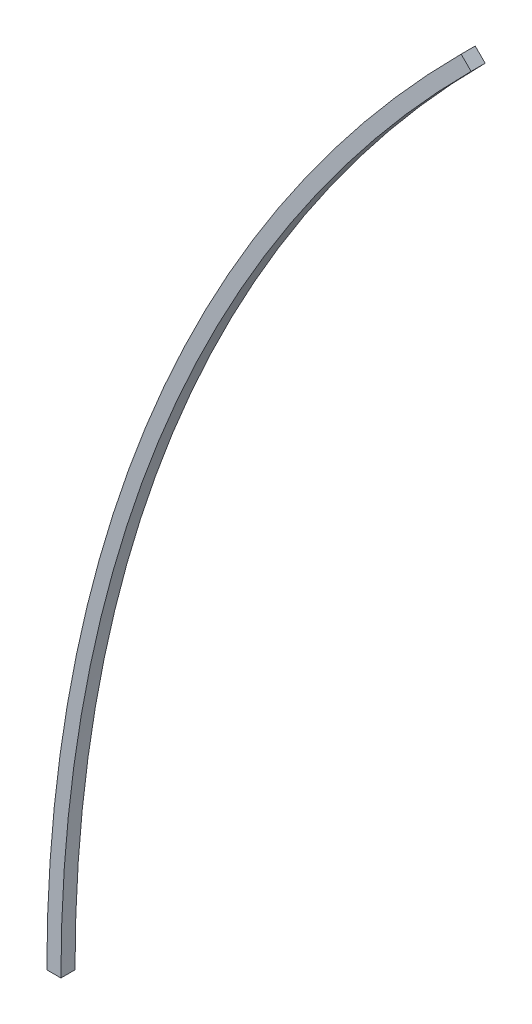
ISO-10303-21;
HEADER;
FILE_DESCRIPTION(('STEP AP214'),'2;1');
FILE_NAME('part.step','',(''),(''),'','','');
FILE_SCHEMA(('AUTOMOTIVE_DESIGN { 1 0 10303 214 1 1 1 1 }'));
ENDSEC;
DATA;
#1=APPLICATION_CONTEXT('core data for automotive mechanical design processes');
#2=APPLICATION_PROTOCOL_DEFINITION('international standard','automotive_design',2000,#1);
#3=PRODUCT_CONTEXT('',#1,'mechanical');
#4=PRODUCT('Part','Part','',(#3));
#5=PRODUCT_RELATED_PRODUCT_CATEGORY('part','',(#4));
#6=PRODUCT_DEFINITION_FORMATION('','',#4);
#7=PRODUCT_DEFINITION_CONTEXT('part definition',#1,'design');
#8=PRODUCT_DEFINITION('design','',#6,#7);
#9=PRODUCT_DEFINITION_SHAPE('','',#8);
#10=(LENGTH_UNIT() NAMED_UNIT(*) SI_UNIT(.MILLI.,.METRE.));
#11=(NAMED_UNIT(*) PLANE_ANGLE_UNIT() SI_UNIT($,.RADIAN.));
#12=(NAMED_UNIT(*) SI_UNIT($,.STERADIAN.) SOLID_ANGLE_UNIT());
#13=UNCERTAINTY_MEASURE_WITH_UNIT(LENGTH_MEASURE(1.E-05),#10,'distance_accuracy_value','');
#14=(GEOMETRIC_REPRESENTATION_CONTEXT(3) GLOBAL_UNCERTAINTY_ASSIGNED_CONTEXT((#13)) GLOBAL_UNIT_ASSIGNED_CONTEXT((#10,
#11,#12)) REPRESENTATION_CONTEXT('',''));
#15=CARTESIAN_POINT('',(0.,0.,0.));
#16=DIRECTION('',(0.,0.,1.));
#17=DIRECTION('',(1.,0.,0.));
#18=AXIS2_PLACEMENT_3D('',#15,#16,#17);
#19=CARTESIAN_POINT('',(2540.,0.,0.));
#20=DIRECTION('',(0.,0.,1.));
#21=DIRECTION('',(1.,0.,0.));
#22=AXIS2_PLACEMENT_3D('',#19,#20,#21);
#23=CYLINDRICAL_SURFACE('',#22,2527.3);
#24=CARTESIAN_POINT('',(2540.,0.,-12.7));
#25=DIRECTION('',(0.,0.,1.));
#26=DIRECTION('',(1.,0.,0.));
#27=AXIS2_PLACEMENT_3D('',#24,#25,#26);
#28=CIRCLE('',#27,2527.3);
#29=CARTESIAN_POINT('',(752.929031907242,1787.07096809276,-12.7));
#30=VERTEX_POINT('',#29);
#31=CARTESIAN_POINT('',(12.7,0.,-12.7));
#32=VERTEX_POINT('',#31);
#33=EDGE_CURVE('E11',#30,#32,#28,.T.);
#34=ORIENTED_EDGE('',*,*,#33,.F.);
#35=DIRECTION('',(0.,0.,-1.));
#36=VECTOR('',#35,1.);
#37=CARTESIAN_POINT('',(752.929031907242,1787.07096809276,12.7));
#38=LINE('',#37,#36);
#39=CARTESIAN_POINT('',(752.929031907242,1787.07096809276,12.7));
#40=VERTEX_POINT('',#39);
#41=EDGE_CURVE('E100',#40,#30,#38,.T.);
#42=ORIENTED_EDGE('',*,*,#41,.F.);
#43=CARTESIAN_POINT('',(2540.,0.,12.7));
#44=DIRECTION('',(0.,0.,1.));
#45=DIRECTION('',(1.,0.,0.));
#46=AXIS2_PLACEMENT_3D('',#43,#44,#45);
#47=CIRCLE('',#46,2527.3);
#48=CARTESIAN_POINT('',(12.7,0.,12.7));
#49=VERTEX_POINT('',#48);
#50=EDGE_CURVE('E53',#40,#49,#47,.T.);
#51=ORIENTED_EDGE('',*,*,#50,.T.);
#52=DIRECTION('',(0.,0.,-1.));
#53=VECTOR('',#52,1.);
#54=CARTESIAN_POINT('',(12.7,0.,12.7));
#55=LINE('',#54,#53);
#56=EDGE_CURVE('E89',#49,#32,#55,.T.);
#57=ORIENTED_EDGE('',*,*,#56,.T.);
#58=EDGE_LOOP('',(#34,#42,#51,#57));
#59=FACE_BOUND('',#58,.T.);
#60=ADVANCED_FACE('F38',(#59),#23,.F.);
#61=CARTESIAN_POINT('',(752.929031907242,1787.07096809276,-12.7));
#62=DIRECTION('',(0.,0.,1.));
#63=DIRECTION('',(1.,0.,0.));
#64=AXIS2_PLACEMENT_3D('',#61,#62,#63);
#65=PLANE('',#64);
#66=CARTESIAN_POINT('',(2540.,0.,-12.7));
#67=DIRECTION('',(0.,0.,1.));
#68=DIRECTION('',(1.,0.,0.));
#69=AXIS2_PLACEMENT_3D('',#66,#67,#68);
#70=CIRCLE('',#69,2552.7);
#71=CARTESIAN_POINT('',(734.968519665103,1805.0314803349,-12.7));
#72=VERTEX_POINT('',#71);
#73=CARTESIAN_POINT('',(-12.7,0.,-12.7));
#74=VERTEX_POINT('',#73);
#75=EDGE_CURVE('E46',#72,#74,#70,.T.);
#76=ORIENTED_EDGE('',*,*,#75,.F.);
#77=DIRECTION('',(-0.707106781186546,0.707106781186549,0.));
#78=VECTOR('',#77,1.);
#79=CARTESIAN_POINT('',(752.929031907242,1787.07096809276,-12.7));
#80=LINE('',#79,#78);
#81=EDGE_CURVE('E85',#30,#72,#80,.T.);
#82=ORIENTED_EDGE('',*,*,#81,.F.);
#83=ORIENTED_EDGE('',*,*,#33,.T.);
#84=DIRECTION('',(-1.,0.,0.));
#85=VECTOR('',#84,1.);
#86=CARTESIAN_POINT('',(12.7,0.,-12.7));
#87=LINE('',#86,#85);
#88=EDGE_CURVE('E82',#32,#74,#87,.T.);
#89=ORIENTED_EDGE('',*,*,#88,.T.);
#90=EDGE_LOOP('',(#76,#82,#83,#89));
#91=FACE_BOUND('',#90,.T.);
#92=ADVANCED_FACE('F40',(#91),#65,.F.);
#93=CARTESIAN_POINT('',(2540.,0.,0.));
#94=DIRECTION('',(0.,0.,1.));
#95=DIRECTION('',(1.,0.,0.));
#96=AXIS2_PLACEMENT_3D('',#93,#94,#95);
#97=CYLINDRICAL_SURFACE('',#96,2552.7);
#98=CARTESIAN_POINT('',(2540.,0.,12.7));
#99=DIRECTION('',(0.,0.,1.));
#100=DIRECTION('',(1.,0.,0.));
#101=AXIS2_PLACEMENT_3D('',#98,#99,#100);
#102=CIRCLE('',#101,2552.7);
#103=CARTESIAN_POINT('',(734.968519665103,1805.0314803349,12.7));
#104=VERTEX_POINT('',#103);
#105=CARTESIAN_POINT('',(-12.7,0.,12.7));
#106=VERTEX_POINT('',#105);
#107=EDGE_CURVE('E61',#104,#106,#102,.T.);
#108=ORIENTED_EDGE('',*,*,#107,.F.);
#109=DIRECTION('',(0.,0.,1.));
#110=VECTOR('',#109,1.);
#111=CARTESIAN_POINT('',(734.968519665103,1805.0314803349,12.7));
#112=LINE('',#111,#110);
#113=EDGE_CURVE('E103',#72,#104,#112,.T.);
#114=ORIENTED_EDGE('',*,*,#113,.F.);
#115=ORIENTED_EDGE('',*,*,#75,.T.);
#116=DIRECTION('',(0.,0.,1.));
#117=VECTOR('',#116,1.);
#118=CARTESIAN_POINT('',(-12.7,0.,12.7));
#119=LINE('',#118,#117);
#120=EDGE_CURVE('E94',#74,#106,#119,.T.);
#121=ORIENTED_EDGE('',*,*,#120,.T.);
#122=EDGE_LOOP('',(#108,#114,#115,#121));
#123=FACE_BOUND('',#122,.T.);
#124=ADVANCED_FACE('F109',(#123),#97,.T.);
#125=CARTESIAN_POINT('',(752.929031907242,1787.07096809276,12.7));
#126=DIRECTION('',(0.,0.,-1.));
#127=DIRECTION('',(-1.,0.,0.));
#128=AXIS2_PLACEMENT_3D('',#125,#126,#127);
#129=PLANE('',#128);
#130=DIRECTION('',(0.707106781186546,-0.707106781186549,0.));
#131=VECTOR('',#130,1.);
#132=CARTESIAN_POINT('',(752.929031907242,1787.07096809276,12.7));
#133=LINE('',#132,#131);
#134=EDGE_CURVE('E105',#104,#40,#133,.T.);
#135=ORIENTED_EDGE('',*,*,#134,.F.);
#136=ORIENTED_EDGE('',*,*,#107,.T.);
#137=DIRECTION('',(1.,0.,0.));
#138=VECTOR('',#137,1.);
#139=CARTESIAN_POINT('',(12.7,0.,12.7));
#140=LINE('',#139,#138);
#141=EDGE_CURVE('E96',#106,#49,#140,.T.);
#142=ORIENTED_EDGE('',*,*,#141,.T.);
#143=ORIENTED_EDGE('',*,*,#50,.F.);
#144=EDGE_LOOP('',(#135,#136,#142,#143));
#145=FACE_BOUND('',#144,.T.);
#146=ADVANCED_FACE('F112',(#145),#129,.F.);
#147=CARTESIAN_POINT('',(752.929031907242,1787.07096809276,-12.7));
#148=DIRECTION('',(0.707106781186549,0.707106781186546,0.));
#149=DIRECTION('',(0.,0.,1.));
#150=AXIS2_PLACEMENT_3D('',#147,#148,#149);
#151=PLANE('',#150);
#152=ORIENTED_EDGE('',*,*,#41,.T.);
#153=ORIENTED_EDGE('',*,*,#81,.T.);
#154=ORIENTED_EDGE('',*,*,#113,.T.);
#155=ORIENTED_EDGE('',*,*,#134,.T.);
#156=EDGE_LOOP('',(#152,#153,#154,#155));
#157=FACE_BOUND('',#156,.T.);
#158=ADVANCED_FACE('F111',(#157),#151,.T.);
#159=CARTESIAN_POINT('',(12.7,0.,-12.7));
#160=DIRECTION('',(0.,1.,0.));
#161=DIRECTION('',(0.,0.,1.));
#162=AXIS2_PLACEMENT_3D('',#159,#160,#161);
#163=PLANE('',#162);
#164=ORIENTED_EDGE('',*,*,#56,.F.);
#165=ORIENTED_EDGE('',*,*,#141,.F.);
#166=ORIENTED_EDGE('',*,*,#120,.F.);
#167=ORIENTED_EDGE('',*,*,#88,.F.);
#168=EDGE_LOOP('',(#164,#165,#166,#167));
#169=FACE_BOUND('',#168,.T.);
#170=ADVANCED_FACE('F93',(#169),#163,.F.);
#171=CLOSED_SHELL('',(#60,#92,#124,#146,#158,#170));
#172=MANIFOLD_SOLID_BREP('B2',#171);
#173=ADVANCED_BREP_SHAPE_REPRESENTATION('',(#18,#172),#14);
#174=SHAPE_DEFINITION_REPRESENTATION(#9,#173);
ENDSEC;
END-ISO-10303-21;
